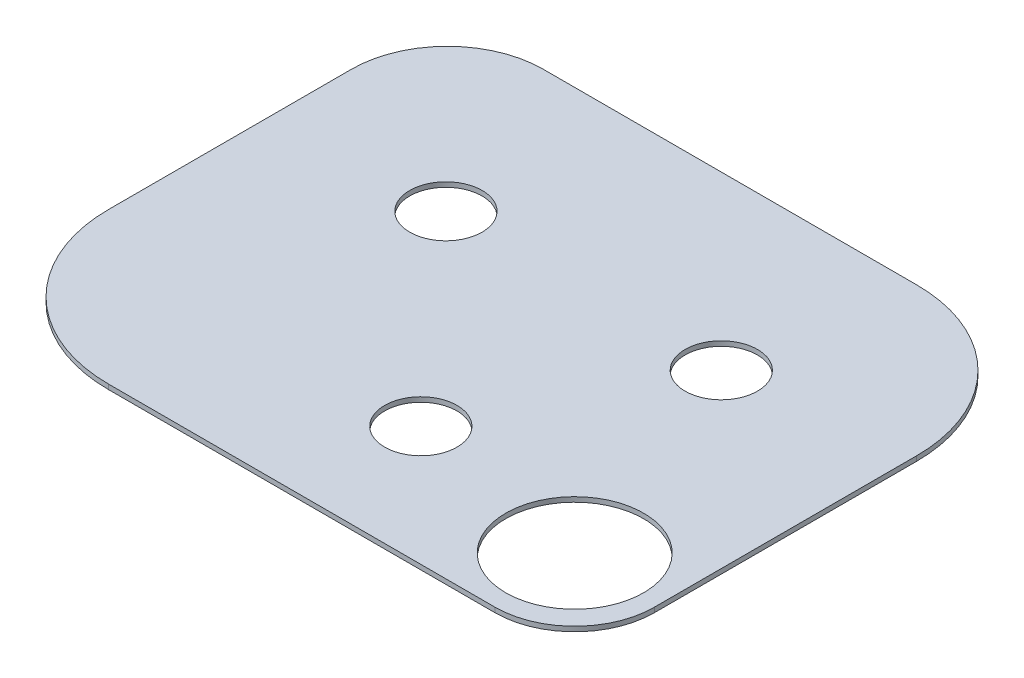
ISO-10303-21;
HEADER;
FILE_DESCRIPTION(('STEP AP214'),'2;1');
FILE_NAME('part.step','',(''),(''),'','','');
FILE_SCHEMA(('AUTOMOTIVE_DESIGN { 1 0 10303 214 1 1 1 1 }'));
ENDSEC;
DATA;
#1=APPLICATION_CONTEXT('core data for automotive mechanical design processes');
#2=APPLICATION_PROTOCOL_DEFINITION('international standard','automotive_design',2000,#1);
#3=PRODUCT_CONTEXT('',#1,'mechanical');
#4=PRODUCT('Part','Part','',(#3));
#5=PRODUCT_RELATED_PRODUCT_CATEGORY('part','',(#4));
#6=PRODUCT_DEFINITION_FORMATION('','',#4);
#7=PRODUCT_DEFINITION_CONTEXT('part definition',#1,'design');
#8=PRODUCT_DEFINITION('design','',#6,#7);
#9=PRODUCT_DEFINITION_SHAPE('','',#8);
#10=(LENGTH_UNIT() NAMED_UNIT(*) SI_UNIT(.MILLI.,.METRE.));
#11=(NAMED_UNIT(*) PLANE_ANGLE_UNIT() SI_UNIT($,.RADIAN.));
#12=(NAMED_UNIT(*) SI_UNIT($,.STERADIAN.) SOLID_ANGLE_UNIT());
#13=UNCERTAINTY_MEASURE_WITH_UNIT(LENGTH_MEASURE(1.E-05),#10,'distance_accuracy_value','');
#14=(GEOMETRIC_REPRESENTATION_CONTEXT(3) GLOBAL_UNCERTAINTY_ASSIGNED_CONTEXT((#13)) GLOBAL_UNIT_ASSIGNED_CONTEXT((#10,
#11,#12)) REPRESENTATION_CONTEXT('',''));
#15=CARTESIAN_POINT('',(0.,0.,0.));
#16=DIRECTION('',(0.,0.,1.));
#17=DIRECTION('',(1.,0.,0.));
#18=AXIS2_PLACEMENT_3D('',#15,#16,#17);
#19=CARTESIAN_POINT('',(-64.,1.,50.8));
#20=DIRECTION('',(1.,0.,0.));
#21=DIRECTION('',(0.,0.,-1.));
#22=AXIS2_PLACEMENT_3D('',#19,#20,#21);
#23=PLANE('',#22);
#24=DIRECTION('',(0.,0.,1.));
#25=VECTOR('',#24,1.);
#26=CARTESIAN_POINT('',(-64.,1.,50.8));
#27=LINE('',#26,#25);
#28=CARTESIAN_POINT('',(-64.,1.,-30.92364950115));
#29=VERTEX_POINT('',#28);
#30=CARTESIAN_POINT('',(-64.,1.,19.4223564798719));
#31=VERTEX_POINT('',#30);
#32=EDGE_CURVE('E128',#29,#31,#27,.T.);
#33=ORIENTED_EDGE('',*,*,#32,.F.);
#34=DIRECTION('',(0.,1.,0.));
#35=VECTOR('',#34,1.);
#36=CARTESIAN_POINT('',(-64.,0.,-30.92364950115));
#37=LINE('',#36,#35);
#38=CARTESIAN_POINT('',(-64.,0.,-30.92364950115));
#39=VERTEX_POINT('',#38);
#40=EDGE_CURVE('E170',#39,#29,#37,.T.);
#41=ORIENTED_EDGE('',*,*,#40,.F.);
#42=DIRECTION('',(0.,0.,1.));
#43=VECTOR('',#42,1.);
#44=CARTESIAN_POINT('',(-64.,0.,50.8));
#45=LINE('',#44,#43);
#46=CARTESIAN_POINT('',(-64.,0.,19.4223564798719));
#47=VERTEX_POINT('',#46);
#48=EDGE_CURVE('E140',#39,#47,#45,.T.);
#49=ORIENTED_EDGE('',*,*,#48,.T.);
#50=DIRECTION('',(0.,1.,0.));
#51=VECTOR('',#50,1.);
#52=CARTESIAN_POINT('',(-64.,0.,19.4223564798719));
#53=LINE('',#52,#51);
#54=EDGE_CURVE('E145',#47,#31,#53,.T.);
#55=ORIENTED_EDGE('',*,*,#54,.T.);
#56=EDGE_LOOP('',(#33,#41,#49,#55));
#57=FACE_BOUND('',#56,.T.);
#58=ADVANCED_FACE('F39',(#57),#23,.F.);
#59=CARTESIAN_POINT('',(64.,1.,50.8));
#60=DIRECTION('',(0.,0.,-1.));
#61=DIRECTION('',(-1.,0.,0.));
#62=AXIS2_PLACEMENT_3D('',#59,#60,#61);
#63=PLANE('',#62);
#64=DIRECTION('',(0.,1.,0.));
#65=VECTOR('',#64,1.);
#66=CARTESIAN_POINT('',(47.49,0.,50.8));
#67=LINE('',#66,#65);
#68=CARTESIAN_POINT('',(47.49,0.,50.8));
#69=VERTEX_POINT('',#68);
#70=CARTESIAN_POINT('',(47.49,1.,50.8));
#71=VERTEX_POINT('',#70);
#72=EDGE_CURVE('E56',#69,#71,#67,.T.);
#73=ORIENTED_EDGE('',*,*,#72,.T.);
#74=DIRECTION('',(1.,0.,0.));
#75=VECTOR('',#74,1.);
#76=CARTESIAN_POINT('',(64.,1.,50.8));
#77=LINE('',#76,#75);
#78=CARTESIAN_POINT('',(-32.6223564798719,1.,50.8));
#79=VERTEX_POINT('',#78);
#80=EDGE_CURVE('E133',#79,#71,#77,.T.);
#81=ORIENTED_EDGE('',*,*,#80,.F.);
#82=DIRECTION('',(0.,1.,0.));
#83=VECTOR('',#82,1.);
#84=CARTESIAN_POINT('',(-32.6223564798719,0.,50.8));
#85=LINE('',#84,#83);
#86=CARTESIAN_POINT('',(-32.6223564798719,0.,50.8));
#87=VERTEX_POINT('',#86);
#88=EDGE_CURVE('E153',#87,#79,#85,.T.);
#89=ORIENTED_EDGE('',*,*,#88,.F.);
#90=DIRECTION('',(1.,0.,0.));
#91=VECTOR('',#90,1.);
#92=CARTESIAN_POINT('',(64.,0.,50.8));
#93=LINE('',#92,#91);
#94=EDGE_CURVE('E135',#87,#69,#93,.T.);
#95=ORIENTED_EDGE('',*,*,#94,.T.);
#96=EDGE_LOOP('',(#73,#81,#89,#95));
#97=FACE_BOUND('',#96,.T.);
#98=ADVANCED_FACE('F249',(#97),#63,.F.);
#99=CARTESIAN_POINT('',(64.,1.,50.8));
#100=DIRECTION('',(-1.,0.,0.));
#101=DIRECTION('',(0.,0.,1.));
#102=AXIS2_PLACEMENT_3D('',#99,#100,#101);
#103=PLANE('',#102);
#104=DIRECTION('',(0.,0.,-1.));
#105=VECTOR('',#104,1.);
#106=CARTESIAN_POINT('',(64.,1.,50.8));
#107=LINE('',#106,#105);
#108=CARTESIAN_POINT('',(64.,1.,34.29));
#109=VERTEX_POINT('',#108);
#110=CARTESIAN_POINT('',(64.,1.,-20.1164587579331));
#111=VERTEX_POINT('',#110);
#112=EDGE_CURVE('E48',#109,#111,#107,.T.);
#113=ORIENTED_EDGE('',*,*,#112,.F.);
#114=DIRECTION('',(0.,1.,0.));
#115=VECTOR('',#114,1.);
#116=CARTESIAN_POINT('',(64.,0.,34.29));
#117=LINE('',#116,#115);
#118=CARTESIAN_POINT('',(64.,0.,34.29));
#119=VERTEX_POINT('',#118);
#120=EDGE_CURVE('E163',#119,#109,#117,.T.);
#121=ORIENTED_EDGE('',*,*,#120,.F.);
#122=DIRECTION('',(0.,0.,-1.));
#123=VECTOR('',#122,1.);
#124=CARTESIAN_POINT('',(64.,0.,50.8));
#125=LINE('',#124,#123);
#126=CARTESIAN_POINT('',(64.,0.,-20.1164587579331));
#127=VERTEX_POINT('',#126);
#128=EDGE_CURVE('E129',#119,#127,#125,.T.);
#129=ORIENTED_EDGE('',*,*,#128,.T.);
#130=DIRECTION('',(0.,1.,0.));
#131=VECTOR('',#130,1.);
#132=CARTESIAN_POINT('',(64.,0.,-20.1164587579331));
#133=LINE('',#132,#131);
#134=EDGE_CURVE('E64',#127,#111,#133,.T.);
#135=ORIENTED_EDGE('',*,*,#134,.T.);
#136=EDGE_LOOP('',(#113,#121,#129,#135));
#137=FACE_BOUND('',#136,.T.);
#138=ADVANCED_FACE('F245',(#137),#103,.F.);
#139=CARTESIAN_POINT('',(64.,1.,-50.8));
#140=DIRECTION('',(0.,0.,1.));
#141=DIRECTION('',(1.,0.,0.));
#142=AXIS2_PLACEMENT_3D('',#139,#140,#141);
#143=PLANE('',#142);
#144=DIRECTION('',(0.,1.,0.));
#145=VECTOR('',#144,1.);
#146=CARTESIAN_POINT('',(-44.12364950115,0.,-50.8));
#147=LINE('',#146,#145);
#148=CARTESIAN_POINT('',(-44.12364950115,0.,-50.8));
#149=VERTEX_POINT('',#148);
#150=CARTESIAN_POINT('',(-44.12364950115,1.,-50.8));
#151=VERTEX_POINT('',#150);
#152=EDGE_CURVE('E167',#149,#151,#147,.T.);
#153=ORIENTED_EDGE('',*,*,#152,.T.);
#154=DIRECTION('',(-1.,0.,0.));
#155=VECTOR('',#154,1.);
#156=CARTESIAN_POINT('',(64.,1.,-50.8));
#157=LINE('',#156,#155);
#158=CARTESIAN_POINT('',(33.3164587579331,1.,-50.8));
#159=VERTEX_POINT('',#158);
#160=EDGE_CURVE('E11',#159,#151,#157,.T.);
#161=ORIENTED_EDGE('',*,*,#160,.F.);
#162=DIRECTION('',(0.,1.,0.));
#163=VECTOR('',#162,1.);
#164=CARTESIAN_POINT('',(33.3164587579331,0.,-50.8));
#165=LINE('',#164,#163);
#166=CARTESIAN_POINT('',(33.3164587579331,0.,-50.8));
#167=VERTEX_POINT('',#166);
#168=EDGE_CURVE('E106',#167,#159,#165,.T.);
#169=ORIENTED_EDGE('',*,*,#168,.F.);
#170=DIRECTION('',(-1.,0.,0.));
#171=VECTOR('',#170,1.);
#172=CARTESIAN_POINT('',(64.,0.,-50.8));
#173=LINE('',#172,#171);
#174=EDGE_CURVE('E42',#167,#149,#173,.T.);
#175=ORIENTED_EDGE('',*,*,#174,.T.);
#176=EDGE_LOOP('',(#153,#161,#169,#175));
#177=FACE_BOUND('',#176,.T.);
#178=ADVANCED_FACE('F119',(#177),#143,.F.);
#179=CARTESIAN_POINT('',(0.,1.,0.));
#180=DIRECTION('',(0.,1.,0.));
#181=DIRECTION('',(0.,0.,1.));
#182=AXIS2_PLACEMENT_3D('',#179,#180,#181);
#183=PLANE('',#182);
#184=CARTESIAN_POINT('',(28.4,1.,-15.2));
#185=DIRECTION('',(0.,1.,0.));
#186=DIRECTION('',(0.,0.,1.));
#187=AXIS2_PLACEMENT_3D('',#184,#185,#186);
#188=CIRCLE('',#187,7.5);
#189=CARTESIAN_POINT('',(28.4,1.,-7.70000000000001));
#190=VERTEX_POINT('',#189);
#191=EDGE_CURVE('E200',#190,#190,#188,.T.);
#192=ORIENTED_EDGE('',*,*,#191,.F.);
#193=EDGE_LOOP('',(#192));
#194=FACE_BOUND('',#193,.T.);
#195=CARTESIAN_POINT('',(-28.7,1.,-15.2));
#196=DIRECTION('',(0.,1.,0.));
#197=DIRECTION('',(0.,0.,1.));
#198=AXIS2_PLACEMENT_3D('',#195,#196,#197);
#199=CIRCLE('',#198,7.5);
#200=CARTESIAN_POINT('',(-28.7,1.,-7.70000000000001));
#201=VERTEX_POINT('',#200);
#202=EDGE_CURVE('E208',#201,#201,#199,.T.);
#203=ORIENTED_EDGE('',*,*,#202,.F.);
#204=EDGE_LOOP('',(#203));
#205=FACE_BOUND('',#204,.T.);
#206=CARTESIAN_POINT('',(7.29999999999999,1.,26.));
#207=DIRECTION('',(0.,1.,0.));
#208=DIRECTION('',(0.,0.,1.));
#209=AXIS2_PLACEMENT_3D('',#206,#207,#208);
#210=CIRCLE('',#209,7.5);
#211=CARTESIAN_POINT('',(7.29999999999999,1.,33.5));
#212=VERTEX_POINT('',#211);
#213=EDGE_CURVE('E216',#212,#212,#210,.T.);
#214=ORIENTED_EDGE('',*,*,#213,.F.);
#215=EDGE_LOOP('',(#214));
#216=FACE_BOUND('',#215,.T.);
#217=CARTESIAN_POINT('',(46.,1.,32.8));
#218=DIRECTION('',(0.,1.,0.));
#219=DIRECTION('',(0.,0.,1.));
#220=AXIS2_PLACEMENT_3D('',#217,#218,#219);
#221=CIRCLE('',#220,14.3);
#222=CARTESIAN_POINT('',(46.,1.,47.1));
#223=VERTEX_POINT('',#222);
#224=EDGE_CURVE('E192',#223,#223,#221,.T.);
#225=ORIENTED_EDGE('',*,*,#224,.F.);
#226=EDGE_LOOP('',(#225));
#227=FACE_BOUND('',#226,.T.);
#228=CARTESIAN_POINT('',(47.49,1.,34.29));
#229=DIRECTION('',(0.,-1.,0.));
#230=DIRECTION('',(0.,0.,-1.));
#231=AXIS2_PLACEMENT_3D('',#228,#229,#230);
#232=CIRCLE('',#231,16.51);
#233=EDGE_CURVE('E173',#109,#71,#232,.T.);
#234=ORIENTED_EDGE('',*,*,#233,.F.);
#235=ORIENTED_EDGE('',*,*,#112,.T.);
#236=CARTESIAN_POINT('',(33.3164587579331,1.,-20.1164587579331));
#237=DIRECTION('',(0.,-1.,0.));
#238=DIRECTION('',(0.,0.,-1.));
#239=AXIS2_PLACEMENT_3D('',#236,#237,#238);
#240=CIRCLE('',#239,30.6835412420669);
#241=EDGE_CURVE('E113',#159,#111,#240,.T.);
#242=ORIENTED_EDGE('',*,*,#241,.F.);
#243=ORIENTED_EDGE('',*,*,#160,.T.);
#244=CARTESIAN_POINT('',(-44.12364950115,1.,-30.92364950115));
#245=DIRECTION('',(0.,-1.,0.));
#246=DIRECTION('',(0.,0.,-1.));
#247=AXIS2_PLACEMENT_3D('',#244,#245,#246);
#248=CIRCLE('',#247,19.87635049885);
#249=EDGE_CURVE('E121',#29,#151,#248,.T.);
#250=ORIENTED_EDGE('',*,*,#249,.F.);
#251=ORIENTED_EDGE('',*,*,#32,.T.);
#252=CARTESIAN_POINT('',(-32.6223564798719,1.,19.4223564798719));
#253=DIRECTION('',(0.,-1.,0.));
#254=DIRECTION('',(0.,0.,-1.));
#255=AXIS2_PLACEMENT_3D('',#252,#253,#254);
#256=CIRCLE('',#255,31.3776435201281);
#257=EDGE_CURVE('E160',#79,#31,#256,.T.);
#258=ORIENTED_EDGE('',*,*,#257,.F.);
#259=ORIENTED_EDGE('',*,*,#80,.T.);
#260=EDGE_LOOP('',(#234,#235,#242,#243,#250,#251,#258,#259));
#261=FACE_BOUND('',#260,.T.);
#262=ADVANCED_FACE('F234',(#194,#205,#216,#227,#261),#183,.T.);
#263=CARTESIAN_POINT('',(0.,0.,0.));
#264=DIRECTION('',(0.,1.,0.));
#265=DIRECTION('',(0.,0.,1.));
#266=AXIS2_PLACEMENT_3D('',#263,#264,#265);
#267=PLANE('',#266);
#268=CARTESIAN_POINT('',(28.4,0.,-15.2));
#269=DIRECTION('',(0.,1.,0.));
#270=DIRECTION('',(0.,0.,1.));
#271=AXIS2_PLACEMENT_3D('',#268,#269,#270);
#272=CIRCLE('',#271,7.5);
#273=CARTESIAN_POINT('',(28.4,0.,-7.70000000000001));
#274=VERTEX_POINT('',#273);
#275=EDGE_CURVE('E204',#274,#274,#272,.T.);
#276=ORIENTED_EDGE('',*,*,#275,.T.);
#277=EDGE_LOOP('',(#276));
#278=FACE_BOUND('',#277,.T.);
#279=CARTESIAN_POINT('',(-28.7,0.,-15.2));
#280=DIRECTION('',(0.,1.,0.));
#281=DIRECTION('',(0.,0.,1.));
#282=AXIS2_PLACEMENT_3D('',#279,#280,#281);
#283=CIRCLE('',#282,7.5);
#284=CARTESIAN_POINT('',(-28.7,0.,-7.70000000000001));
#285=VERTEX_POINT('',#284);
#286=EDGE_CURVE('E212',#285,#285,#283,.T.);
#287=ORIENTED_EDGE('',*,*,#286,.T.);
#288=EDGE_LOOP('',(#287));
#289=FACE_BOUND('',#288,.T.);
#290=CARTESIAN_POINT('',(7.29999999999999,0.,26.));
#291=DIRECTION('',(0.,1.,0.));
#292=DIRECTION('',(0.,0.,1.));
#293=AXIS2_PLACEMENT_3D('',#290,#291,#292);
#294=CIRCLE('',#293,7.5);
#295=CARTESIAN_POINT('',(7.29999999999999,0.,33.5));
#296=VERTEX_POINT('',#295);
#297=EDGE_CURVE('E196',#296,#296,#294,.T.);
#298=ORIENTED_EDGE('',*,*,#297,.T.);
#299=EDGE_LOOP('',(#298));
#300=FACE_BOUND('',#299,.T.);
#301=CARTESIAN_POINT('',(46.,0.,32.8));
#302=DIRECTION('',(0.,1.,0.));
#303=DIRECTION('',(0.,0.,1.));
#304=AXIS2_PLACEMENT_3D('',#301,#302,#303);
#305=CIRCLE('',#304,14.3);
#306=CARTESIAN_POINT('',(46.,0.,47.1));
#307=VERTEX_POINT('',#306);
#308=EDGE_CURVE('E190',#307,#307,#305,.T.);
#309=ORIENTED_EDGE('',*,*,#308,.T.);
#310=EDGE_LOOP('',(#309));
#311=FACE_BOUND('',#310,.T.);
#312=ORIENTED_EDGE('',*,*,#128,.F.);
#313=CARTESIAN_POINT('',(47.49,0.,34.29));
#314=DIRECTION('',(0.,-1.,0.));
#315=DIRECTION('',(0.,0.,-1.));
#316=AXIS2_PLACEMENT_3D('',#313,#314,#315);
#317=CIRCLE('',#316,16.51);
#318=EDGE_CURVE('E180',#119,#69,#317,.T.);
#319=ORIENTED_EDGE('',*,*,#318,.T.);
#320=ORIENTED_EDGE('',*,*,#94,.F.);
#321=CARTESIAN_POINT('',(-32.6223564798719,0.,19.4223564798719));
#322=DIRECTION('',(0.,-1.,0.));
#323=DIRECTION('',(0.,0.,-1.));
#324=AXIS2_PLACEMENT_3D('',#321,#322,#323);
#325=CIRCLE('',#324,31.3776435201281);
#326=EDGE_CURVE('E156',#87,#47,#325,.T.);
#327=ORIENTED_EDGE('',*,*,#326,.T.);
#328=ORIENTED_EDGE('',*,*,#48,.F.);
#329=CARTESIAN_POINT('',(-44.12364950115,0.,-30.92364950115));
#330=DIRECTION('',(0.,-1.,0.));
#331=DIRECTION('',(0.,0.,-1.));
#332=AXIS2_PLACEMENT_3D('',#329,#330,#331);
#333=CIRCLE('',#332,19.87635049885);
#334=EDGE_CURVE('E126',#39,#149,#333,.T.);
#335=ORIENTED_EDGE('',*,*,#334,.T.);
#336=ORIENTED_EDGE('',*,*,#174,.F.);
#337=CARTESIAN_POINT('',(33.3164587579331,0.,-20.1164587579331));
#338=DIRECTION('',(0.,-1.,0.));
#339=DIRECTION('',(0.,0.,-1.));
#340=AXIS2_PLACEMENT_3D('',#337,#338,#339);
#341=CIRCLE('',#340,30.6835412420669);
#342=EDGE_CURVE('E103',#167,#127,#341,.T.);
#343=ORIENTED_EDGE('',*,*,#342,.T.);
#344=EDGE_LOOP('',(#312,#319,#320,#327,#328,#335,#336,#343));
#345=FACE_BOUND('',#344,.T.);
#346=ADVANCED_FACE('F124',(#278,#289,#300,#311,#345),#267,.F.);
#347=CARTESIAN_POINT('',(-32.6223564798719,0.,19.4223564798719));
#348=DIRECTION('',(0.,1.,0.));
#349=DIRECTION('',(0.,0.,1.));
#350=AXIS2_PLACEMENT_3D('',#347,#348,#349);
#351=CYLINDRICAL_SURFACE('',#350,31.3776435201281);
#352=ORIENTED_EDGE('',*,*,#257,.T.);
#353=ORIENTED_EDGE('',*,*,#54,.F.);
#354=ORIENTED_EDGE('',*,*,#326,.F.);
#355=ORIENTED_EDGE('',*,*,#88,.T.);
#356=EDGE_LOOP('',(#352,#353,#354,#355));
#357=FACE_BOUND('',#356,.T.);
#358=ADVANCED_FACE('F251',(#357),#351,.T.);
#359=CARTESIAN_POINT('',(33.3164587579331,0.,-20.1164587579331));
#360=DIRECTION('',(0.,1.,0.));
#361=DIRECTION('',(0.,0.,1.));
#362=AXIS2_PLACEMENT_3D('',#359,#360,#361);
#363=CYLINDRICAL_SURFACE('',#362,30.6835412420669);
#364=ORIENTED_EDGE('',*,*,#241,.T.);
#365=ORIENTED_EDGE('',*,*,#134,.F.);
#366=ORIENTED_EDGE('',*,*,#342,.F.);
#367=ORIENTED_EDGE('',*,*,#168,.T.);
#368=EDGE_LOOP('',(#364,#365,#366,#367));
#369=FACE_BOUND('',#368,.T.);
#370=ADVANCED_FACE('F105',(#369),#363,.T.);
#371=CARTESIAN_POINT('',(-44.12364950115,0.,-30.92364950115));
#372=DIRECTION('',(0.,1.,0.));
#373=DIRECTION('',(0.,0.,1.));
#374=AXIS2_PLACEMENT_3D('',#371,#372,#373);
#375=CYLINDRICAL_SURFACE('',#374,19.87635049885);
#376=ORIENTED_EDGE('',*,*,#249,.T.);
#377=ORIENTED_EDGE('',*,*,#152,.F.);
#378=ORIENTED_EDGE('',*,*,#334,.F.);
#379=ORIENTED_EDGE('',*,*,#40,.T.);
#380=EDGE_LOOP('',(#376,#377,#378,#379));
#381=FACE_BOUND('',#380,.T.);
#382=ADVANCED_FACE('F257',(#381),#375,.T.);
#383=CARTESIAN_POINT('',(47.49,0.,34.29));
#384=DIRECTION('',(0.,1.,0.));
#385=DIRECTION('',(0.,0.,1.));
#386=AXIS2_PLACEMENT_3D('',#383,#384,#385);
#387=CYLINDRICAL_SURFACE('',#386,16.51);
#388=ORIENTED_EDGE('',*,*,#233,.T.);
#389=ORIENTED_EDGE('',*,*,#72,.F.);
#390=ORIENTED_EDGE('',*,*,#318,.F.);
#391=ORIENTED_EDGE('',*,*,#120,.T.);
#392=EDGE_LOOP('',(#388,#389,#390,#391));
#393=FACE_BOUND('',#392,.T.);
#394=ADVANCED_FACE('F259',(#393),#387,.T.);
#395=CARTESIAN_POINT('',(46.,0.,32.8));
#396=DIRECTION('',(0.,1.,0.));
#397=DIRECTION('',(0.,0.,1.));
#398=AXIS2_PLACEMENT_3D('',#395,#396,#397);
#399=CYLINDRICAL_SURFACE('',#398,14.3);
#400=ORIENTED_EDGE('',*,*,#308,.F.);
#401=EDGE_LOOP('',(#400));
#402=FACE_BOUND('',#401,.T.);
#403=ORIENTED_EDGE('',*,*,#224,.T.);
#404=EDGE_LOOP('',(#403));
#405=FACE_BOUND('',#404,.T.);
#406=ADVANCED_FACE('F230',(#402,#405),#399,.F.);
#407=CARTESIAN_POINT('',(7.29999999999999,0.,26.));
#408=DIRECTION('',(0.,1.,0.));
#409=DIRECTION('',(0.,0.,1.));
#410=AXIS2_PLACEMENT_3D('',#407,#408,#409);
#411=CYLINDRICAL_SURFACE('',#410,7.5);
#412=ORIENTED_EDGE('',*,*,#297,.F.);
#413=EDGE_LOOP('',(#412));
#414=FACE_BOUND('',#413,.T.);
#415=ORIENTED_EDGE('',*,*,#213,.T.);
#416=EDGE_LOOP('',(#415));
#417=FACE_BOUND('',#416,.T.);
#418=ADVANCED_FACE('F226',(#414,#417),#411,.F.);
#419=CARTESIAN_POINT('',(-28.7,0.,-15.2));
#420=DIRECTION('',(0.,1.,0.));
#421=DIRECTION('',(0.,0.,1.));
#422=AXIS2_PLACEMENT_3D('',#419,#420,#421);
#423=CYLINDRICAL_SURFACE('',#422,7.5);
#424=ORIENTED_EDGE('',*,*,#286,.F.);
#425=EDGE_LOOP('',(#424));
#426=FACE_BOUND('',#425,.T.);
#427=ORIENTED_EDGE('',*,*,#202,.T.);
#428=EDGE_LOOP('',(#427));
#429=FACE_BOUND('',#428,.T.);
#430=ADVANCED_FACE('F229',(#426,#429),#423,.F.);
#431=CARTESIAN_POINT('',(28.4,0.,-15.2));
#432=DIRECTION('',(0.,1.,0.));
#433=DIRECTION('',(0.,0.,1.));
#434=AXIS2_PLACEMENT_3D('',#431,#432,#433);
#435=CYLINDRICAL_SURFACE('',#434,7.5);
#436=ORIENTED_EDGE('',*,*,#275,.F.);
#437=EDGE_LOOP('',(#436));
#438=FACE_BOUND('',#437,.T.);
#439=ORIENTED_EDGE('',*,*,#191,.T.);
#440=EDGE_LOOP('',(#439));
#441=FACE_BOUND('',#440,.T.);
#442=ADVANCED_FACE('F336',(#438,#441),#435,.F.);
#443=CLOSED_SHELL('',(#58,#98,#138,#178,#262,#346,#358,#370,#382,#394,#406,#418,#430,#442));
#444=MANIFOLD_SOLID_BREP('B2',#443);
#445=ADVANCED_BREP_SHAPE_REPRESENTATION('',(#18,#444),#14);
#446=SHAPE_DEFINITION_REPRESENTATION(#9,#445);
ENDSEC;
END-ISO-10303-21;
